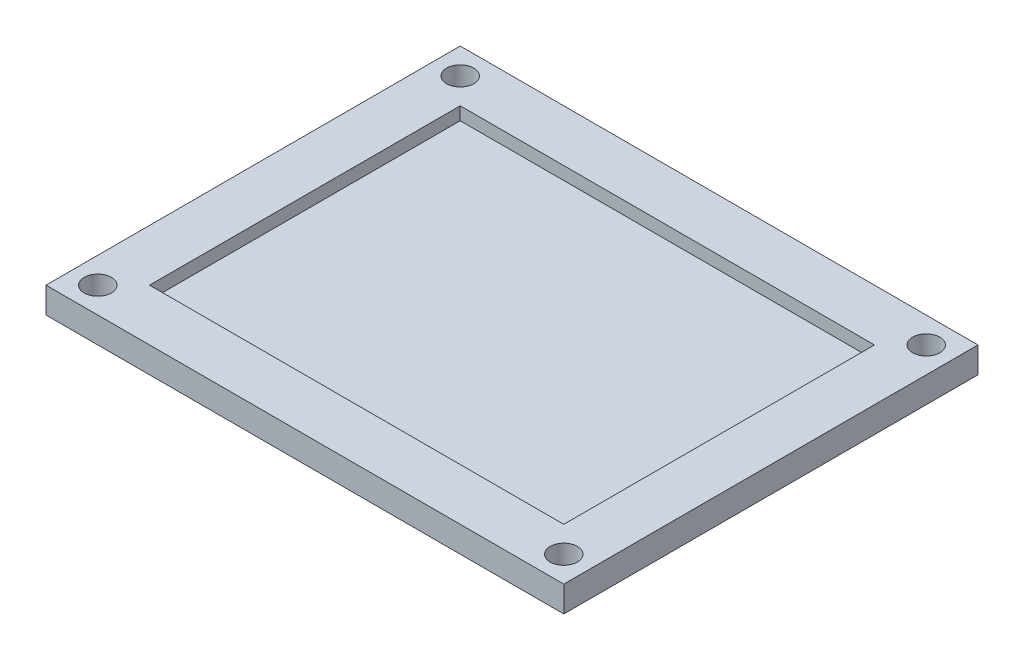
ISO-10303-21;
HEADER;
FILE_DESCRIPTION(('STEP AP214'),'2;1');
FILE_NAME('part.step','',(''),(''),'','','');
FILE_SCHEMA(('AUTOMOTIVE_DESIGN { 1 0 10303 214 1 1 1 1 }'));
ENDSEC;
DATA;
#1=APPLICATION_CONTEXT('core data for automotive mechanical design processes');
#2=APPLICATION_PROTOCOL_DEFINITION('international standard','automotive_design',2000,#1);
#3=PRODUCT_CONTEXT('',#1,'mechanical');
#4=PRODUCT('Part','Part','',(#3));
#5=PRODUCT_RELATED_PRODUCT_CATEGORY('part','',(#4));
#6=PRODUCT_DEFINITION_FORMATION('','',#4);
#7=PRODUCT_DEFINITION_CONTEXT('part definition',#1,'design');
#8=PRODUCT_DEFINITION('design','',#6,#7);
#9=PRODUCT_DEFINITION_SHAPE('','',#8);
#10=(LENGTH_UNIT() NAMED_UNIT(*) SI_UNIT(.MILLI.,.METRE.));
#11=(NAMED_UNIT(*) PLANE_ANGLE_UNIT() SI_UNIT($,.RADIAN.));
#12=(NAMED_UNIT(*) SI_UNIT($,.STERADIAN.) SOLID_ANGLE_UNIT());
#13=UNCERTAINTY_MEASURE_WITH_UNIT(LENGTH_MEASURE(1.E-05),#10,'distance_accuracy_value','');
#14=(GEOMETRIC_REPRESENTATION_CONTEXT(3) GLOBAL_UNCERTAINTY_ASSIGNED_CONTEXT((#13)) GLOBAL_UNIT_ASSIGNED_CONTEXT((#10,
#11,#12)) REPRESENTATION_CONTEXT('',''));
#15=CARTESIAN_POINT('',(0.,0.,0.));
#16=DIRECTION('',(0.,0.,1.));
#17=DIRECTION('',(1.,0.,0.));
#18=AXIS2_PLACEMENT_3D('',#15,#16,#17);
#19=CARTESIAN_POINT('',(-100.,10.,80.));
#20=DIRECTION('',(1.,0.,0.));
#21=DIRECTION('',(0.,0.,-1.));
#22=AXIS2_PLACEMENT_3D('',#19,#20,#21);
#23=PLANE('',#22);
#24=DIRECTION('',(0.,0.,1.));
#25=VECTOR('',#24,1.);
#26=CARTESIAN_POINT('',(-100.,0.,80.));
#27=LINE('',#26,#25);
#28=CARTESIAN_POINT('',(-100.,0.,-80.));
#29=VERTEX_POINT('',#28);
#30=CARTESIAN_POINT('',(-100.,0.,80.));
#31=VERTEX_POINT('',#30);
#32=EDGE_CURVE('E150',#29,#31,#27,.T.);
#33=ORIENTED_EDGE('',*,*,#32,.T.);
#34=DIRECTION('',(0.,-1.,0.));
#35=VECTOR('',#34,1.);
#36=CARTESIAN_POINT('',(-100.,10.,80.));
#37=LINE('',#36,#35);
#38=CARTESIAN_POINT('',(-100.,10.,80.));
#39=VERTEX_POINT('',#38);
#40=EDGE_CURVE('E11',#39,#31,#37,.T.);
#41=ORIENTED_EDGE('',*,*,#40,.F.);
#42=DIRECTION('',(0.,0.,1.));
#43=VECTOR('',#42,1.);
#44=CARTESIAN_POINT('',(-100.,10.,80.));
#45=LINE('',#44,#43);
#46=CARTESIAN_POINT('',(-100.,10.,-80.));
#47=VERTEX_POINT('',#46);
#48=EDGE_CURVE('E154',#47,#39,#45,.T.);
#49=ORIENTED_EDGE('',*,*,#48,.F.);
#50=DIRECTION('',(0.,-1.,0.));
#51=VECTOR('',#50,1.);
#52=CARTESIAN_POINT('',(-100.,10.,-80.));
#53=LINE('',#52,#51);
#54=EDGE_CURVE('E160',#47,#29,#53,.T.);
#55=ORIENTED_EDGE('',*,*,#54,.T.);
#56=EDGE_LOOP('',(#33,#41,#49,#55));
#57=FACE_BOUND('',#56,.T.);
#58=ADVANCED_FACE('F38',(#57),#23,.F.);
#59=CARTESIAN_POINT('',(100.,10.,80.));
#60=DIRECTION('',(0.,0.,-1.));
#61=DIRECTION('',(-1.,0.,0.));
#62=AXIS2_PLACEMENT_3D('',#59,#60,#61);
#63=PLANE('',#62);
#64=DIRECTION('',(1.,0.,0.));
#65=VECTOR('',#64,1.);
#66=CARTESIAN_POINT('',(100.,0.,80.));
#67=LINE('',#66,#65);
#68=CARTESIAN_POINT('',(100.,0.,80.));
#69=VERTEX_POINT('',#68);
#70=EDGE_CURVE('E163',#31,#69,#67,.T.);
#71=ORIENTED_EDGE('',*,*,#70,.T.);
#72=DIRECTION('',(0.,-1.,0.));
#73=VECTOR('',#72,1.);
#74=CARTESIAN_POINT('',(100.,10.,80.));
#75=LINE('',#74,#73);
#76=CARTESIAN_POINT('',(100.,10.,80.));
#77=VERTEX_POINT('',#76);
#78=EDGE_CURVE('E45',#77,#69,#75,.T.);
#79=ORIENTED_EDGE('',*,*,#78,.F.);
#80=DIRECTION('',(1.,0.,0.));
#81=VECTOR('',#80,1.);
#82=CARTESIAN_POINT('',(100.,10.,80.));
#83=LINE('',#82,#81);
#84=EDGE_CURVE('E89',#39,#77,#83,.T.);
#85=ORIENTED_EDGE('',*,*,#84,.F.);
#86=ORIENTED_EDGE('',*,*,#40,.T.);
#87=EDGE_LOOP('',(#71,#79,#85,#86));
#88=FACE_BOUND('',#87,.T.);
#89=ADVANCED_FACE('F192',(#88),#63,.F.);
#90=CARTESIAN_POINT('',(100.,10.,80.));
#91=DIRECTION('',(-1.,0.,0.));
#92=DIRECTION('',(0.,0.,1.));
#93=AXIS2_PLACEMENT_3D('',#90,#91,#92);
#94=PLANE('',#93);
#95=DIRECTION('',(0.,0.,-1.));
#96=VECTOR('',#95,1.);
#97=CARTESIAN_POINT('',(100.,0.,80.));
#98=LINE('',#97,#96);
#99=CARTESIAN_POINT('',(100.,0.,-80.));
#100=VERTEX_POINT('',#99);
#101=EDGE_CURVE('E165',#69,#100,#98,.T.);
#102=ORIENTED_EDGE('',*,*,#101,.T.);
#103=DIRECTION('',(0.,-1.,0.));
#104=VECTOR('',#103,1.);
#105=CARTESIAN_POINT('',(100.,10.,-80.));
#106=LINE('',#105,#104);
#107=CARTESIAN_POINT('',(100.,10.,-80.));
#108=VERTEX_POINT('',#107);
#109=EDGE_CURVE('E169',#108,#100,#106,.T.);
#110=ORIENTED_EDGE('',*,*,#109,.F.);
#111=DIRECTION('',(0.,0.,-1.));
#112=VECTOR('',#111,1.);
#113=CARTESIAN_POINT('',(100.,10.,80.));
#114=LINE('',#113,#112);
#115=EDGE_CURVE('E157',#77,#108,#114,.T.);
#116=ORIENTED_EDGE('',*,*,#115,.F.);
#117=ORIENTED_EDGE('',*,*,#78,.T.);
#118=EDGE_LOOP('',(#102,#110,#116,#117));
#119=FACE_BOUND('',#118,.T.);
#120=ADVANCED_FACE('F174',(#119),#94,.F.);
#121=CARTESIAN_POINT('',(100.,10.,-80.));
#122=DIRECTION('',(0.,0.,1.));
#123=DIRECTION('',(1.,0.,0.));
#124=AXIS2_PLACEMENT_3D('',#121,#122,#123);
#125=PLANE('',#124);
#126=DIRECTION('',(-1.,0.,0.));
#127=VECTOR('',#126,1.);
#128=CARTESIAN_POINT('',(100.,0.,-80.));
#129=LINE('',#128,#127);
#130=EDGE_CURVE('E82',#100,#29,#129,.T.);
#131=ORIENTED_EDGE('',*,*,#130,.T.);
#132=ORIENTED_EDGE('',*,*,#54,.F.);
#133=DIRECTION('',(-1.,0.,0.));
#134=VECTOR('',#133,1.);
#135=CARTESIAN_POINT('',(100.,10.,-80.));
#136=LINE('',#135,#134);
#137=EDGE_CURVE('E61',#108,#47,#136,.T.);
#138=ORIENTED_EDGE('',*,*,#137,.F.);
#139=ORIENTED_EDGE('',*,*,#109,.T.);
#140=EDGE_LOOP('',(#131,#132,#138,#139));
#141=FACE_BOUND('',#140,.T.);
#142=ADVANCED_FACE('F182',(#141),#125,.F.);
#143=CARTESIAN_POINT('',(0.,10.,0.));
#144=DIRECTION('',(0.,1.,0.));
#145=DIRECTION('',(0.,0.,1.));
#146=AXIS2_PLACEMENT_3D('',#143,#144,#145);
#147=PLANE('',#146);
#148=CARTESIAN_POINT('',(90.,10.,70.));
#149=DIRECTION('',(0.,1.,0.));
#150=DIRECTION('',(0.,0.,1.));
#151=AXIS2_PLACEMENT_3D('',#148,#149,#150);
#152=CIRCLE('',#151,5.25);
#153=CARTESIAN_POINT('',(90.,10.,75.25));
#154=VERTEX_POINT('',#153);
#155=EDGE_CURVE('E137',#154,#154,#152,.T.);
#156=ORIENTED_EDGE('',*,*,#155,.F.);
#157=EDGE_LOOP('',(#156));
#158=FACE_BOUND('',#157,.T.);
#159=CARTESIAN_POINT('',(90.,10.,-70.));
#160=DIRECTION('',(0.,1.,0.));
#161=DIRECTION('',(0.,0.,1.));
#162=AXIS2_PLACEMENT_3D('',#159,#160,#161);
#163=CIRCLE('',#162,5.25);
#164=CARTESIAN_POINT('',(90.,10.,-64.75));
#165=VERTEX_POINT('',#164);
#166=EDGE_CURVE('E381',#165,#165,#163,.T.);
#167=ORIENTED_EDGE('',*,*,#166,.F.);
#168=EDGE_LOOP('',(#167));
#169=FACE_BOUND('',#168,.T.);
#170=CARTESIAN_POINT('',(-90.,10.,70.));
#171=DIRECTION('',(0.,1.,0.));
#172=DIRECTION('',(0.,0.,1.));
#173=AXIS2_PLACEMENT_3D('',#170,#171,#172);
#174=CIRCLE('',#173,5.25);
#175=CARTESIAN_POINT('',(-90.,10.,75.25));
#176=VERTEX_POINT('',#175);
#177=EDGE_CURVE('E379',#176,#176,#174,.T.);
#178=ORIENTED_EDGE('',*,*,#177,.F.);
#179=EDGE_LOOP('',(#178));
#180=FACE_BOUND('',#179,.T.);
#181=CARTESIAN_POINT('',(-90.,10.,-70.));
#182=DIRECTION('',(0.,1.,0.));
#183=DIRECTION('',(0.,0.,1.));
#184=AXIS2_PLACEMENT_3D('',#181,#182,#183);
#185=CIRCLE('',#184,5.25);
#186=CARTESIAN_POINT('',(-90.,10.,-64.75));
#187=VERTEX_POINT('',#186);
#188=EDGE_CURVE('E144',#187,#187,#185,.T.);
#189=ORIENTED_EDGE('',*,*,#188,.F.);
#190=EDGE_LOOP('',(#189));
#191=FACE_BOUND('',#190,.T.);
#192=DIRECTION('',(0.,0.,-1.));
#193=VECTOR('',#192,1.);
#194=CARTESIAN_POINT('',(80.,10.,-60.));
#195=LINE('',#194,#193);
#196=CARTESIAN_POINT('',(80.,10.,60.));
#197=VERTEX_POINT('',#196);
#198=CARTESIAN_POINT('',(80.,10.,-60.));
#199=VERTEX_POINT('',#198);
#200=EDGE_CURVE('E52',#197,#199,#195,.T.);
#201=ORIENTED_EDGE('',*,*,#200,.F.);
#202=DIRECTION('',(1.,0.,0.));
#203=VECTOR('',#202,1.);
#204=CARTESIAN_POINT('',(-80.,10.,60.));
#205=LINE('',#204,#203);
#206=CARTESIAN_POINT('',(-80.,10.,60.));
#207=VERTEX_POINT('',#206);
#208=EDGE_CURVE('E131',#207,#197,#205,.T.);
#209=ORIENTED_EDGE('',*,*,#208,.F.);
#210=DIRECTION('',(0.,0.,1.));
#211=VECTOR('',#210,1.);
#212=CARTESIAN_POINT('',(-80.,10.,-60.));
#213=LINE('',#212,#211);
#214=CARTESIAN_POINT('',(-80.,10.,-60.));
#215=VERTEX_POINT('',#214);
#216=EDGE_CURVE('E134',#215,#207,#213,.T.);
#217=ORIENTED_EDGE('',*,*,#216,.F.);
#218=DIRECTION('',(-1.,0.,0.));
#219=VECTOR('',#218,1.);
#220=CARTESIAN_POINT('',(-80.,10.,-60.));
#221=LINE('',#220,#219);
#222=EDGE_CURVE('E143',#199,#215,#221,.T.);
#223=ORIENTED_EDGE('',*,*,#222,.F.);
#224=EDGE_LOOP('',(#201,#209,#217,#223));
#225=FACE_BOUND('',#224,.T.);
#226=ORIENTED_EDGE('',*,*,#48,.T.);
#227=ORIENTED_EDGE('',*,*,#84,.T.);
#228=ORIENTED_EDGE('',*,*,#115,.T.);
#229=ORIENTED_EDGE('',*,*,#137,.T.);
#230=EDGE_LOOP('',(#226,#227,#228,#229));
#231=FACE_BOUND('',#230,.T.);
#232=ADVANCED_FACE('F184',(#158,#169,#180,#191,#225,#231),#147,.T.);
#233=CARTESIAN_POINT('',(0.,0.,0.));
#234=DIRECTION('',(0.,1.,0.));
#235=DIRECTION('',(0.,0.,1.));
#236=AXIS2_PLACEMENT_3D('',#233,#234,#235);
#237=PLANE('',#236);
#238=CARTESIAN_POINT('',(-90.,0.,70.));
#239=DIRECTION('',(0.,1.,0.));
#240=DIRECTION('',(0.,0.,1.));
#241=AXIS2_PLACEMENT_3D('',#238,#239,#240);
#242=CIRCLE('',#241,5.25);
#243=CARTESIAN_POINT('',(-90.,0.,75.25));
#244=VERTEX_POINT('',#243);
#245=EDGE_CURVE('E367',#244,#244,#242,.T.);
#246=ORIENTED_EDGE('',*,*,#245,.T.);
#247=EDGE_LOOP('',(#246));
#248=FACE_BOUND('',#247,.T.);
#249=CARTESIAN_POINT('',(90.,0.,70.));
#250=DIRECTION('',(0.,1.,0.));
#251=DIRECTION('',(0.,0.,1.));
#252=AXIS2_PLACEMENT_3D('',#249,#250,#251);
#253=CIRCLE('',#252,5.25);
#254=CARTESIAN_POINT('',(90.,0.,75.25));
#255=VERTEX_POINT('',#254);
#256=EDGE_CURVE('E364',#255,#255,#253,.T.);
#257=ORIENTED_EDGE('',*,*,#256,.T.);
#258=EDGE_LOOP('',(#257));
#259=FACE_BOUND('',#258,.T.);
#260=CARTESIAN_POINT('',(90.,0.,-70.));
#261=DIRECTION('',(0.,1.,0.));
#262=DIRECTION('',(0.,0.,1.));
#263=AXIS2_PLACEMENT_3D('',#260,#261,#262);
#264=CIRCLE('',#263,5.25);
#265=CARTESIAN_POINT('',(90.,0.,-64.75));
#266=VERTEX_POINT('',#265);
#267=EDGE_CURVE('E366',#266,#266,#264,.T.);
#268=ORIENTED_EDGE('',*,*,#267,.T.);
#269=EDGE_LOOP('',(#268));
#270=FACE_BOUND('',#269,.T.);
#271=CARTESIAN_POINT('',(-90.,0.,-70.));
#272=DIRECTION('',(0.,1.,0.));
#273=DIRECTION('',(0.,0.,1.));
#274=AXIS2_PLACEMENT_3D('',#271,#272,#273);
#275=CIRCLE('',#274,5.25);
#276=CARTESIAN_POINT('',(-90.,0.,-64.75));
#277=VERTEX_POINT('',#276);
#278=EDGE_CURVE('E370',#277,#277,#275,.T.);
#279=ORIENTED_EDGE('',*,*,#278,.T.);
#280=EDGE_LOOP('',(#279));
#281=FACE_BOUND('',#280,.T.);
#282=ORIENTED_EDGE('',*,*,#32,.F.);
#283=ORIENTED_EDGE('',*,*,#130,.F.);
#284=ORIENTED_EDGE('',*,*,#101,.F.);
#285=ORIENTED_EDGE('',*,*,#70,.F.);
#286=EDGE_LOOP('',(#282,#283,#284,#285));
#287=FACE_BOUND('',#286,.T.);
#288=ADVANCED_FACE('F178',(#248,#259,#270,#281,#287),#237,.F.);
#289=CARTESIAN_POINT('',(80.,5.,-60.));
#290=DIRECTION('',(1.,0.,0.));
#291=DIRECTION('',(0.,0.,-1.));
#292=AXIS2_PLACEMENT_3D('',#289,#290,#291);
#293=PLANE('',#292);
#294=ORIENTED_EDGE('',*,*,#200,.T.);
#295=DIRECTION('',(0.,1.,0.));
#296=VECTOR('',#295,1.);
#297=CARTESIAN_POINT('',(80.,5.,-60.));
#298=LINE('',#297,#296);
#299=CARTESIAN_POINT('',(80.,5.,-60.));
#300=VERTEX_POINT('',#299);
#301=EDGE_CURVE('E109',#300,#199,#298,.T.);
#302=ORIENTED_EDGE('',*,*,#301,.F.);
#303=DIRECTION('',(0.,0.,-1.));
#304=VECTOR('',#303,1.);
#305=CARTESIAN_POINT('',(80.,5.,-60.));
#306=LINE('',#305,#304);
#307=CARTESIAN_POINT('',(80.,5.,60.));
#308=VERTEX_POINT('',#307);
#309=EDGE_CURVE('E113',#308,#300,#306,.T.);
#310=ORIENTED_EDGE('',*,*,#309,.F.);
#311=DIRECTION('',(0.,1.,0.));
#312=VECTOR('',#311,1.);
#313=CARTESIAN_POINT('',(80.,5.,60.));
#314=LINE('',#313,#312);
#315=EDGE_CURVE('E148',#308,#197,#314,.T.);
#316=ORIENTED_EDGE('',*,*,#315,.T.);
#317=EDGE_LOOP('',(#294,#302,#310,#316));
#318=FACE_BOUND('',#317,.T.);
#319=ADVANCED_FACE('F111',(#318),#293,.F.);
#320=CARTESIAN_POINT('',(-80.,5.,60.));
#321=DIRECTION('',(0.,0.,1.));
#322=DIRECTION('',(1.,0.,0.));
#323=AXIS2_PLACEMENT_3D('',#320,#321,#322);
#324=PLANE('',#323);
#325=ORIENTED_EDGE('',*,*,#208,.T.);
#326=ORIENTED_EDGE('',*,*,#315,.F.);
#327=DIRECTION('',(1.,0.,0.));
#328=VECTOR('',#327,1.);
#329=CARTESIAN_POINT('',(-80.,5.,60.));
#330=LINE('',#329,#328);
#331=CARTESIAN_POINT('',(-80.,5.,60.));
#332=VERTEX_POINT('',#331);
#333=EDGE_CURVE('E119',#332,#308,#330,.T.);
#334=ORIENTED_EDGE('',*,*,#333,.F.);
#335=DIRECTION('',(0.,1.,0.));
#336=VECTOR('',#335,1.);
#337=CARTESIAN_POINT('',(-80.,5.,60.));
#338=LINE('',#337,#336);
#339=EDGE_CURVE('E151',#332,#207,#338,.T.);
#340=ORIENTED_EDGE('',*,*,#339,.T.);
#341=EDGE_LOOP('',(#325,#326,#334,#340));
#342=FACE_BOUND('',#341,.T.);
#343=ADVANCED_FACE('F229',(#342),#324,.F.);
#344=CARTESIAN_POINT('',(-80.,5.,-60.));
#345=DIRECTION('',(-1.,0.,0.));
#346=DIRECTION('',(0.,0.,1.));
#347=AXIS2_PLACEMENT_3D('',#344,#345,#346);
#348=PLANE('',#347);
#349=ORIENTED_EDGE('',*,*,#216,.T.);
#350=ORIENTED_EDGE('',*,*,#339,.F.);
#351=DIRECTION('',(0.,0.,1.));
#352=VECTOR('',#351,1.);
#353=CARTESIAN_POINT('',(-80.,5.,-60.));
#354=LINE('',#353,#352);
#355=CARTESIAN_POINT('',(-80.,5.,-60.));
#356=VERTEX_POINT('',#355);
#357=EDGE_CURVE('E127',#356,#332,#354,.T.);
#358=ORIENTED_EDGE('',*,*,#357,.F.);
#359=DIRECTION('',(0.,1.,0.));
#360=VECTOR('',#359,1.);
#361=CARTESIAN_POINT('',(-80.,5.,-60.));
#362=LINE('',#361,#360);
#363=EDGE_CURVE('E118',#356,#215,#362,.T.);
#364=ORIENTED_EDGE('',*,*,#363,.T.);
#365=EDGE_LOOP('',(#349,#350,#358,#364));
#366=FACE_BOUND('',#365,.T.);
#367=ADVANCED_FACE('F239',(#366),#348,.F.);
#368=CARTESIAN_POINT('',(-80.,5.,-60.));
#369=DIRECTION('',(0.,0.,-1.));
#370=DIRECTION('',(-1.,0.,0.));
#371=AXIS2_PLACEMENT_3D('',#368,#369,#370);
#372=PLANE('',#371);
#373=ORIENTED_EDGE('',*,*,#222,.T.);
#374=ORIENTED_EDGE('',*,*,#363,.F.);
#375=DIRECTION('',(-1.,0.,0.));
#376=VECTOR('',#375,1.);
#377=CARTESIAN_POINT('',(-80.,5.,-60.));
#378=LINE('',#377,#376);
#379=EDGE_CURVE('E122',#300,#356,#378,.T.);
#380=ORIENTED_EDGE('',*,*,#379,.F.);
#381=ORIENTED_EDGE('',*,*,#301,.T.);
#382=EDGE_LOOP('',(#373,#374,#380,#381));
#383=FACE_BOUND('',#382,.T.);
#384=ADVANCED_FACE('F123',(#383),#372,.F.);
#385=CARTESIAN_POINT('',(0.,5.,0.));
#386=DIRECTION('',(0.,1.,0.));
#387=DIRECTION('',(0.,0.,1.));
#388=AXIS2_PLACEMENT_3D('',#385,#386,#387);
#389=PLANE('',#388);
#390=ORIENTED_EDGE('',*,*,#309,.T.);
#391=ORIENTED_EDGE('',*,*,#379,.T.);
#392=ORIENTED_EDGE('',*,*,#357,.T.);
#393=ORIENTED_EDGE('',*,*,#333,.T.);
#394=EDGE_LOOP('',(#390,#391,#392,#393));
#395=FACE_BOUND('',#394,.T.);
#396=ADVANCED_FACE('F129',(#395),#389,.T.);
#397=CARTESIAN_POINT('',(-90.,5.,-70.));
#398=DIRECTION('',(0.,1.,0.));
#399=DIRECTION('',(0.,0.,1.));
#400=AXIS2_PLACEMENT_3D('',#397,#398,#399);
#401=CYLINDRICAL_SURFACE('',#400,5.25);
#402=ORIENTED_EDGE('',*,*,#188,.T.);
#403=EDGE_LOOP('',(#402));
#404=FACE_BOUND('',#403,.T.);
#405=ORIENTED_EDGE('',*,*,#278,.F.);
#406=EDGE_LOOP('',(#405));
#407=FACE_BOUND('',#406,.T.);
#408=ADVANCED_FACE('F269',(#404,#407),#401,.F.);
#409=CARTESIAN_POINT('',(-90.,5.,70.));
#410=DIRECTION('',(0.,1.,0.));
#411=DIRECTION('',(0.,0.,1.));
#412=AXIS2_PLACEMENT_3D('',#409,#410,#411);
#413=CYLINDRICAL_SURFACE('',#412,5.25);
#414=ORIENTED_EDGE('',*,*,#177,.T.);
#415=EDGE_LOOP('',(#414));
#416=FACE_BOUND('',#415,.T.);
#417=ORIENTED_EDGE('',*,*,#245,.F.);
#418=EDGE_LOOP('',(#417));
#419=FACE_BOUND('',#418,.T.);
#420=ADVANCED_FACE('F287',(#416,#419),#413,.F.);
#421=CARTESIAN_POINT('',(90.,5.,-70.));
#422=DIRECTION('',(0.,1.,0.));
#423=DIRECTION('',(0.,0.,1.));
#424=AXIS2_PLACEMENT_3D('',#421,#422,#423);
#425=CYLINDRICAL_SURFACE('',#424,5.25);
#426=ORIENTED_EDGE('',*,*,#166,.T.);
#427=EDGE_LOOP('',(#426));
#428=FACE_BOUND('',#427,.T.);
#429=ORIENTED_EDGE('',*,*,#267,.F.);
#430=EDGE_LOOP('',(#429));
#431=FACE_BOUND('',#430,.T.);
#432=ADVANCED_FACE('F298',(#428,#431),#425,.F.);
#433=CARTESIAN_POINT('',(90.,5.,70.));
#434=DIRECTION('',(0.,1.,0.));
#435=DIRECTION('',(0.,0.,1.));
#436=AXIS2_PLACEMENT_3D('',#433,#434,#435);
#437=CYLINDRICAL_SURFACE('',#436,5.25);
#438=ORIENTED_EDGE('',*,*,#155,.T.);
#439=EDGE_LOOP('',(#438));
#440=FACE_BOUND('',#439,.T.);
#441=ORIENTED_EDGE('',*,*,#256,.F.);
#442=EDGE_LOOP('',(#441));
#443=FACE_BOUND('',#442,.T.);
#444=ADVANCED_FACE('F309',(#440,#443),#437,.F.);
#445=CLOSED_SHELL('',(#58,#89,#120,#142,#232,#288,#319,#343,#367,#384,#396,#408,#420,#432,#444));
#446=MANIFOLD_SOLID_BREP('B2',#445);
#447=ADVANCED_BREP_SHAPE_REPRESENTATION('',(#18,#446),#14);
#448=SHAPE_DEFINITION_REPRESENTATION(#9,#447);
ENDSEC;
END-ISO-10303-21;
